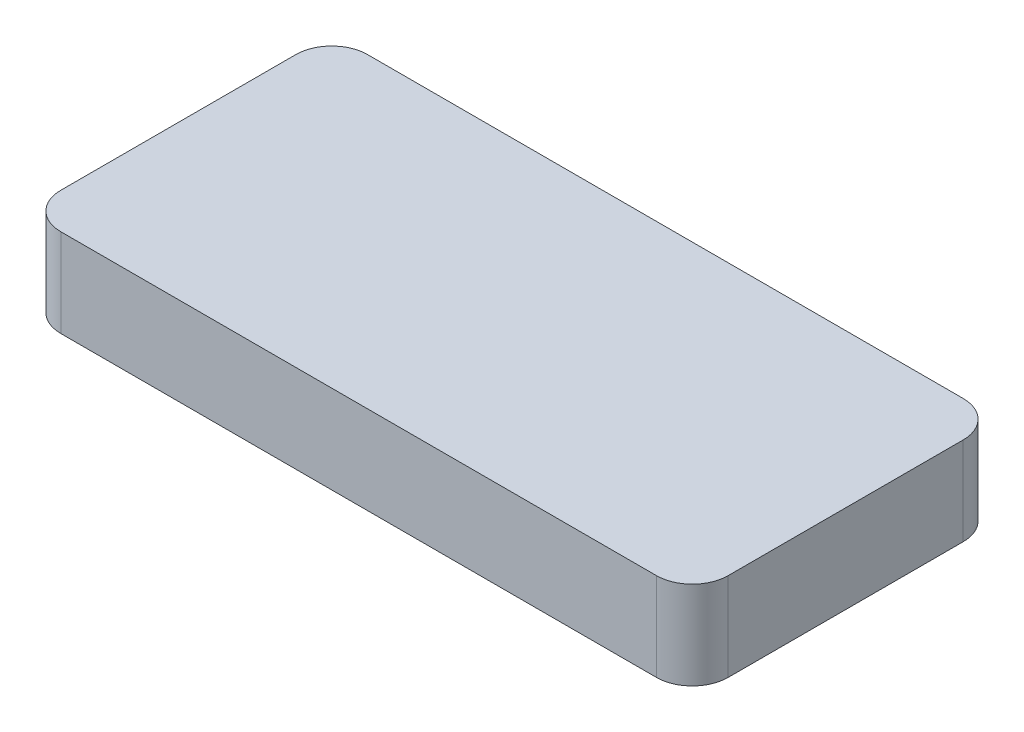
ISO-10303-21;
HEADER;
FILE_DESCRIPTION(('STEP AP214'),'2;1');
FILE_NAME('part.step','',(''),(''),'','','');
FILE_SCHEMA(('AUTOMOTIVE_DESIGN { 1 0 10303 214 1 1 1 1 }'));
ENDSEC;
DATA;
#1=APPLICATION_CONTEXT('core data for automotive mechanical design processes');
#2=APPLICATION_PROTOCOL_DEFINITION('international standard','automotive_design',2000,#1);
#3=PRODUCT_CONTEXT('',#1,'mechanical');
#4=PRODUCT('Part','Part','',(#3));
#5=PRODUCT_RELATED_PRODUCT_CATEGORY('part','',(#4));
#6=PRODUCT_DEFINITION_FORMATION('','',#4);
#7=PRODUCT_DEFINITION_CONTEXT('part definition',#1,'design');
#8=PRODUCT_DEFINITION('design','',#6,#7);
#9=PRODUCT_DEFINITION_SHAPE('','',#8);
#10=(LENGTH_UNIT() NAMED_UNIT(*) SI_UNIT(.MILLI.,.METRE.));
#11=(NAMED_UNIT(*) PLANE_ANGLE_UNIT() SI_UNIT($,.RADIAN.));
#12=(NAMED_UNIT(*) SI_UNIT($,.STERADIAN.) SOLID_ANGLE_UNIT());
#13=UNCERTAINTY_MEASURE_WITH_UNIT(LENGTH_MEASURE(1.E-05),#10,'distance_accuracy_value','');
#14=(GEOMETRIC_REPRESENTATION_CONTEXT(3) GLOBAL_UNCERTAINTY_ASSIGNED_CONTEXT((#13)) GLOBAL_UNIT_ASSIGNED_CONTEXT((#10,
#11,#12)) REPRESENTATION_CONTEXT('',''));
#15=CARTESIAN_POINT('',(0.,0.,0.));
#16=DIRECTION('',(0.,0.,1.));
#17=DIRECTION('',(1.,0.,0.));
#18=AXIS2_PLACEMENT_3D('',#15,#16,#17);
#19=CARTESIAN_POINT('',(0.,0.,0.));
#20=DIRECTION('',(0.,1.,0.));
#21=DIRECTION('',(0.,0.,1.));
#22=AXIS2_PLACEMENT_3D('',#19,#20,#21);
#23=PLANE('',#22);
#24=CARTESIAN_POINT('',(16.6,0.,6.55));
#25=DIRECTION('',(0.,1.,0.));
#26=DIRECTION('',(0.,0.,1.));
#27=AXIS2_PLACEMENT_3D('',#24,#25,#26);
#28=CIRCLE('',#27,2.);
#29=CARTESIAN_POINT('',(18.6,0.,6.55));
#30=VERTEX_POINT('',#29);
#31=CARTESIAN_POINT('',(16.6,0.,8.55));
#32=VERTEX_POINT('',#31);
#33=EDGE_CURVE('E36',#30,#32,#28,.F.);
#34=ORIENTED_EDGE('',*,*,#33,.T.);
#35=DIRECTION('',(1.,0.,0.));
#36=VECTOR('',#35,1.);
#37=CARTESIAN_POINT('',(-18.6,0.,8.55));
#38=LINE('',#37,#36);
#39=CARTESIAN_POINT('',(-16.6,0.,8.55));
#40=VERTEX_POINT('',#39);
#41=EDGE_CURVE('E145',#40,#32,#38,.T.);
#42=ORIENTED_EDGE('',*,*,#41,.F.);
#43=CARTESIAN_POINT('',(-16.6,0.,6.55));
#44=DIRECTION('',(0.,1.,0.));
#45=DIRECTION('',(0.,0.,1.));
#46=AXIS2_PLACEMENT_3D('',#43,#44,#45);
#47=CIRCLE('',#46,2.);
#48=CARTESIAN_POINT('',(-18.6,0.,6.55));
#49=VERTEX_POINT('',#48);
#50=EDGE_CURVE('E153',#40,#49,#47,.F.);
#51=ORIENTED_EDGE('',*,*,#50,.T.);
#52=DIRECTION('',(0.,0.,1.));
#53=VECTOR('',#52,1.);
#54=CARTESIAN_POINT('',(-18.6,0.,8.55));
#55=LINE('',#54,#53);
#56=CARTESIAN_POINT('',(-18.6,0.,-6.55));
#57=VERTEX_POINT('',#56);
#58=EDGE_CURVE('E147',#57,#49,#55,.T.);
#59=ORIENTED_EDGE('',*,*,#58,.F.);
#60=CARTESIAN_POINT('',(-16.6,0.,-6.55));
#61=DIRECTION('',(0.,1.,0.));
#62=DIRECTION('',(0.,0.,1.));
#63=AXIS2_PLACEMENT_3D('',#60,#61,#62);
#64=CIRCLE('',#63,2.);
#65=CARTESIAN_POINT('',(-16.6,0.,-8.55));
#66=VERTEX_POINT('',#65);
#67=EDGE_CURVE('E11',#57,#66,#64,.F.);
#68=ORIENTED_EDGE('',*,*,#67,.T.);
#69=DIRECTION('',(-1.,0.,0.));
#70=VECTOR('',#69,1.);
#71=CARTESIAN_POINT('',(-18.6,0.,-8.55));
#72=LINE('',#71,#70);
#73=CARTESIAN_POINT('',(16.6,0.,-8.55));
#74=VERTEX_POINT('',#73);
#75=EDGE_CURVE('E49',#74,#66,#72,.T.);
#76=ORIENTED_EDGE('',*,*,#75,.F.);
#77=CARTESIAN_POINT('',(16.6,0.,-6.55));
#78=DIRECTION('',(0.,1.,0.));
#79=DIRECTION('',(0.,0.,1.));
#80=AXIS2_PLACEMENT_3D('',#77,#78,#79);
#81=CIRCLE('',#80,2.);
#82=CARTESIAN_POINT('',(18.6,0.,-6.55));
#83=VERTEX_POINT('',#82);
#84=EDGE_CURVE('E41',#74,#83,#81,.F.);
#85=ORIENTED_EDGE('',*,*,#84,.T.);
#86=DIRECTION('',(0.,0.,-1.));
#87=VECTOR('',#86,1.);
#88=CARTESIAN_POINT('',(18.6,0.,8.55));
#89=LINE('',#88,#87);
#90=EDGE_CURVE('E150',#30,#83,#89,.T.);
#91=ORIENTED_EDGE('',*,*,#90,.F.);
#92=EDGE_LOOP('',(#34,#42,#51,#59,#68,#76,#85,#91));
#93=FACE_BOUND('',#92,.T.);
#94=ADVANCED_FACE('F33',(#93),#23,.F.);
#95=CARTESIAN_POINT('',(18.6,4.915,8.55));
#96=DIRECTION('',(-1.,0.,0.));
#97=DIRECTION('',(0.,0.,1.));
#98=AXIS2_PLACEMENT_3D('',#95,#96,#97);
#99=PLANE('',#98);
#100=DIRECTION('',(0.,-1.,0.));
#101=VECTOR('',#100,1.);
#102=CARTESIAN_POINT('',(18.6,4.915,6.55));
#103=LINE('',#102,#101);
#104=CARTESIAN_POINT('',(18.6,4.915,6.55));
#105=VERTEX_POINT('',#104);
#106=EDGE_CURVE('E116',#105,#30,#103,.T.);
#107=ORIENTED_EDGE('',*,*,#106,.T.);
#108=ORIENTED_EDGE('',*,*,#90,.T.);
#109=DIRECTION('',(0.,-1.,0.));
#110=VECTOR('',#109,1.);
#111=CARTESIAN_POINT('',(18.6,4.915,-6.55));
#112=LINE('',#111,#110);
#113=CARTESIAN_POINT('',(18.6,4.915,-6.55));
#114=VERTEX_POINT('',#113);
#115=EDGE_CURVE('E118',#83,#114,#112,.F.);
#116=ORIENTED_EDGE('',*,*,#115,.T.);
#117=DIRECTION('',(0.,0.,-1.));
#118=VECTOR('',#117,1.);
#119=CARTESIAN_POINT('',(18.6,4.915,8.55));
#120=LINE('',#119,#118);
#121=EDGE_CURVE('E103',#105,#114,#120,.T.);
#122=ORIENTED_EDGE('',*,*,#121,.F.);
#123=EDGE_LOOP('',(#107,#108,#116,#122));
#124=FACE_BOUND('',#123,.T.);
#125=ADVANCED_FACE('F115',(#124),#99,.F.);
#126=CARTESIAN_POINT('',(-18.6,4.915,-8.55));
#127=DIRECTION('',(0.,0.,1.));
#128=DIRECTION('',(1.,0.,0.));
#129=AXIS2_PLACEMENT_3D('',#126,#127,#128);
#130=PLANE('',#129);
#131=DIRECTION('',(0.,-1.,0.));
#132=VECTOR('',#131,1.);
#133=CARTESIAN_POINT('',(16.6,4.915,-8.55));
#134=LINE('',#133,#132);
#135=CARTESIAN_POINT('',(16.6,4.915,-8.55));
#136=VERTEX_POINT('',#135);
#137=EDGE_CURVE('E144',#136,#74,#134,.T.);
#138=ORIENTED_EDGE('',*,*,#137,.T.);
#139=ORIENTED_EDGE('',*,*,#75,.T.);
#140=DIRECTION('',(0.,-1.,0.));
#141=VECTOR('',#140,1.);
#142=CARTESIAN_POINT('',(-16.6,4.915,-8.55));
#143=LINE('',#142,#141);
#144=CARTESIAN_POINT('',(-16.6,4.915,-8.55));
#145=VERTEX_POINT('',#144);
#146=EDGE_CURVE('E142',#66,#145,#143,.F.);
#147=ORIENTED_EDGE('',*,*,#146,.T.);
#148=DIRECTION('',(-1.,0.,0.));
#149=VECTOR('',#148,1.);
#150=CARTESIAN_POINT('',(-18.6,4.915,-8.55));
#151=LINE('',#150,#149);
#152=EDGE_CURVE('E119',#136,#145,#151,.T.);
#153=ORIENTED_EDGE('',*,*,#152,.F.);
#154=EDGE_LOOP('',(#138,#139,#147,#153));
#155=FACE_BOUND('',#154,.T.);
#156=ADVANCED_FACE('F177',(#155),#130,.F.);
#157=CARTESIAN_POINT('',(-18.6,4.915,8.55));
#158=DIRECTION('',(1.,0.,0.));
#159=DIRECTION('',(0.,0.,-1.));
#160=AXIS2_PLACEMENT_3D('',#157,#158,#159);
#161=PLANE('',#160);
#162=DIRECTION('',(0.,-1.,0.));
#163=VECTOR('',#162,1.);
#164=CARTESIAN_POINT('',(-18.6,4.915,-6.55));
#165=LINE('',#164,#163);
#166=CARTESIAN_POINT('',(-18.6,4.915,-6.55));
#167=VERTEX_POINT('',#166);
#168=EDGE_CURVE('E110',#167,#57,#165,.T.);
#169=ORIENTED_EDGE('',*,*,#168,.T.);
#170=ORIENTED_EDGE('',*,*,#58,.T.);
#171=DIRECTION('',(0.,-1.,0.));
#172=VECTOR('',#171,1.);
#173=CARTESIAN_POINT('',(-18.6,4.915,6.55));
#174=LINE('',#173,#172);
#175=CARTESIAN_POINT('',(-18.6,4.915,6.55));
#176=VERTEX_POINT('',#175);
#177=EDGE_CURVE('E140',#49,#176,#174,.F.);
#178=ORIENTED_EDGE('',*,*,#177,.T.);
#179=DIRECTION('',(0.,0.,1.));
#180=VECTOR('',#179,1.);
#181=CARTESIAN_POINT('',(-18.6,4.915,8.55));
#182=LINE('',#181,#180);
#183=EDGE_CURVE('E169',#167,#176,#182,.T.);
#184=ORIENTED_EDGE('',*,*,#183,.F.);
#185=EDGE_LOOP('',(#169,#170,#178,#184));
#186=FACE_BOUND('',#185,.T.);
#187=ADVANCED_FACE('F167',(#186),#161,.F.);
#188=CARTESIAN_POINT('',(-18.6,4.915,8.55));
#189=DIRECTION('',(0.,0.,-1.));
#190=DIRECTION('',(-1.,0.,0.));
#191=AXIS2_PLACEMENT_3D('',#188,#189,#190);
#192=PLANE('',#191);
#193=DIRECTION('',(0.,-1.,0.));
#194=VECTOR('',#193,1.);
#195=CARTESIAN_POINT('',(-16.6,4.915,8.55));
#196=LINE('',#195,#194);
#197=CARTESIAN_POINT('',(-16.6,4.915,8.55));
#198=VERTEX_POINT('',#197);
#199=EDGE_CURVE('E124',#198,#40,#196,.T.);
#200=ORIENTED_EDGE('',*,*,#199,.T.);
#201=ORIENTED_EDGE('',*,*,#41,.T.);
#202=DIRECTION('',(0.,-1.,0.));
#203=VECTOR('',#202,1.);
#204=CARTESIAN_POINT('',(16.6,4.915,8.55));
#205=LINE('',#204,#203);
#206=CARTESIAN_POINT('',(16.6,4.915,8.55));
#207=VERTEX_POINT('',#206);
#208=EDGE_CURVE('E127',#32,#207,#205,.F.);
#209=ORIENTED_EDGE('',*,*,#208,.T.);
#210=DIRECTION('',(1.,0.,0.));
#211=VECTOR('',#210,1.);
#212=CARTESIAN_POINT('',(-18.6,4.915,8.55));
#213=LINE('',#212,#211);
#214=EDGE_CURVE('E106',#198,#207,#213,.T.);
#215=ORIENTED_EDGE('',*,*,#214,.F.);
#216=EDGE_LOOP('',(#200,#201,#209,#215));
#217=FACE_BOUND('',#216,.T.);
#218=ADVANCED_FACE('F159',(#217),#192,.F.);
#219=CARTESIAN_POINT('',(0.,4.915,0.));
#220=DIRECTION('',(0.,-1.,0.));
#221=DIRECTION('',(0.,0.,-1.));
#222=AXIS2_PLACEMENT_3D('',#219,#220,#221);
#223=PLANE('',#222);
#224=ORIENTED_EDGE('',*,*,#214,.T.);
#225=CARTESIAN_POINT('',(16.6,4.915,6.55));
#226=DIRECTION('',(0.,-1.,0.));
#227=DIRECTION('',(0.,0.,-1.));
#228=AXIS2_PLACEMENT_3D('',#225,#226,#227);
#229=CIRCLE('',#228,2.);
#230=EDGE_CURVE('E100',#207,#105,#229,.F.);
#231=ORIENTED_EDGE('',*,*,#230,.T.);
#232=ORIENTED_EDGE('',*,*,#121,.T.);
#233=CARTESIAN_POINT('',(16.6,4.915,-6.55));
#234=DIRECTION('',(0.,-1.,0.));
#235=DIRECTION('',(0.,0.,-1.));
#236=AXIS2_PLACEMENT_3D('',#233,#234,#235);
#237=CIRCLE('',#236,2.);
#238=EDGE_CURVE('E135',#114,#136,#237,.F.);
#239=ORIENTED_EDGE('',*,*,#238,.T.);
#240=ORIENTED_EDGE('',*,*,#152,.T.);
#241=CARTESIAN_POINT('',(-16.6,4.915,-6.55));
#242=DIRECTION('',(0.,-1.,0.));
#243=DIRECTION('',(0.,0.,-1.));
#244=AXIS2_PLACEMENT_3D('',#241,#242,#243);
#245=CIRCLE('',#244,2.);
#246=EDGE_CURVE('E133',#145,#167,#245,.F.);
#247=ORIENTED_EDGE('',*,*,#246,.T.);
#248=ORIENTED_EDGE('',*,*,#183,.T.);
#249=CARTESIAN_POINT('',(-16.6,4.915,6.55));
#250=DIRECTION('',(0.,-1.,0.));
#251=DIRECTION('',(0.,0.,-1.));
#252=AXIS2_PLACEMENT_3D('',#249,#250,#251);
#253=CIRCLE('',#252,2.);
#254=EDGE_CURVE('E111',#176,#198,#253,.F.);
#255=ORIENTED_EDGE('',*,*,#254,.T.);
#256=EDGE_LOOP('',(#224,#231,#232,#239,#240,#247,#248,#255));
#257=FACE_BOUND('',#256,.T.);
#258=ADVANCED_FACE('F102',(#257),#223,.F.);
#259=CARTESIAN_POINT('',(16.6,4.915,6.55));
#260=DIRECTION('',(0.,-1.,0.));
#261=DIRECTION('',(0.,0.,-1.));
#262=AXIS2_PLACEMENT_3D('',#259,#260,#261);
#263=CYLINDRICAL_SURFACE('',#262,2.);
#264=ORIENTED_EDGE('',*,*,#33,.F.);
#265=ORIENTED_EDGE('',*,*,#106,.F.);
#266=ORIENTED_EDGE('',*,*,#230,.F.);
#267=ORIENTED_EDGE('',*,*,#208,.F.);
#268=EDGE_LOOP('',(#264,#265,#266,#267));
#269=FACE_BOUND('',#268,.T.);
#270=ADVANCED_FACE('F122',(#269),#263,.T.);
#271=CARTESIAN_POINT('',(-16.6,4.915,6.55));
#272=DIRECTION('',(0.,-1.,0.));
#273=DIRECTION('',(0.,0.,-1.));
#274=AXIS2_PLACEMENT_3D('',#271,#272,#273);
#275=CYLINDRICAL_SURFACE('',#274,2.);
#276=ORIENTED_EDGE('',*,*,#50,.F.);
#277=ORIENTED_EDGE('',*,*,#199,.F.);
#278=ORIENTED_EDGE('',*,*,#254,.F.);
#279=ORIENTED_EDGE('',*,*,#177,.F.);
#280=EDGE_LOOP('',(#276,#277,#278,#279));
#281=FACE_BOUND('',#280,.T.);
#282=ADVANCED_FACE('F163',(#281),#275,.T.);
#283=CARTESIAN_POINT('',(16.6,4.915,-6.55));
#284=DIRECTION('',(0.,-1.,0.));
#285=DIRECTION('',(0.,0.,-1.));
#286=AXIS2_PLACEMENT_3D('',#283,#284,#285);
#287=CYLINDRICAL_SURFACE('',#286,2.);
#288=ORIENTED_EDGE('',*,*,#84,.F.);
#289=ORIENTED_EDGE('',*,*,#137,.F.);
#290=ORIENTED_EDGE('',*,*,#238,.F.);
#291=ORIENTED_EDGE('',*,*,#115,.F.);
#292=EDGE_LOOP('',(#288,#289,#290,#291));
#293=FACE_BOUND('',#292,.T.);
#294=ADVANCED_FACE('F179',(#293),#287,.T.);
#295=CARTESIAN_POINT('',(-16.6,4.915,-6.55));
#296=DIRECTION('',(0.,-1.,0.));
#297=DIRECTION('',(0.,0.,-1.));
#298=AXIS2_PLACEMENT_3D('',#295,#296,#297);
#299=CYLINDRICAL_SURFACE('',#298,2.);
#300=ORIENTED_EDGE('',*,*,#67,.F.);
#301=ORIENTED_EDGE('',*,*,#168,.F.);
#302=ORIENTED_EDGE('',*,*,#246,.F.);
#303=ORIENTED_EDGE('',*,*,#146,.F.);
#304=EDGE_LOOP('',(#300,#301,#302,#303));
#305=FACE_BOUND('',#304,.T.);
#306=ADVANCED_FACE('F171',(#305),#299,.T.);
#307=CLOSED_SHELL('',(#94,#125,#156,#187,#218,#258,#270,#282,#294,#306));
#308=MANIFOLD_SOLID_BREP('B2',#307);
#309=ADVANCED_BREP_SHAPE_REPRESENTATION('',(#18,#308),#14);
#310=SHAPE_DEFINITION_REPRESENTATION(#9,#309);
ENDSEC;
END-ISO-10303-21;
